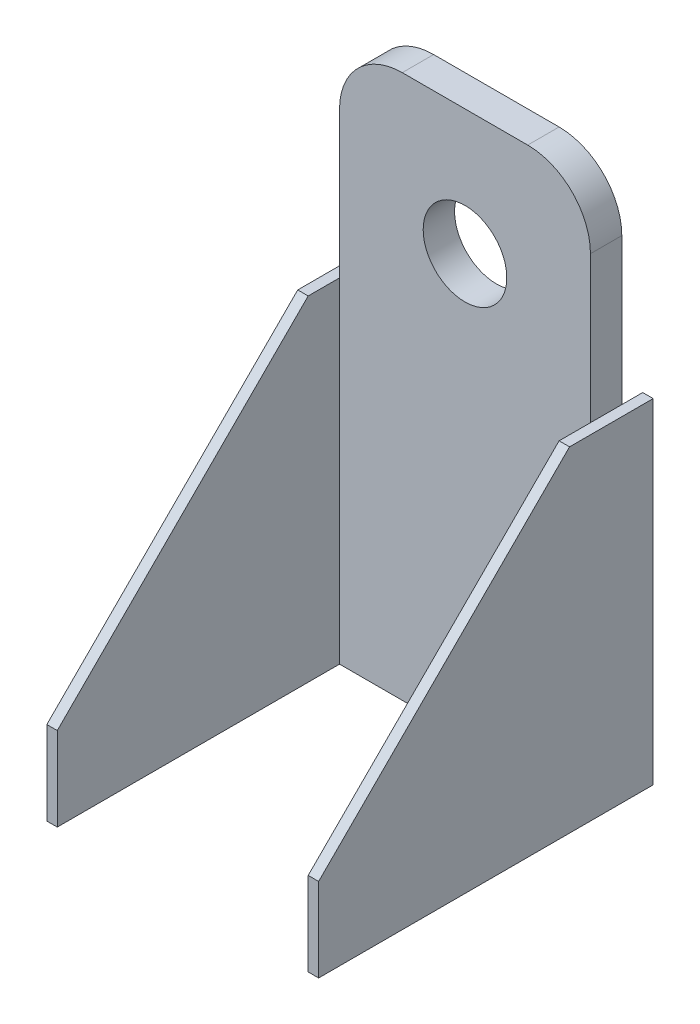
ISO-10303-21;
HEADER;
FILE_DESCRIPTION(('STEP AP214'),'2;1');
FILE_NAME('part.step','',(''),(''),'','','');
FILE_SCHEMA(('AUTOMOTIVE_DESIGN { 1 0 10303 214 1 1 1 1 }'));
ENDSEC;
DATA;
#1=APPLICATION_CONTEXT('core data for automotive mechanical design processes');
#2=APPLICATION_PROTOCOL_DEFINITION('international standard','automotive_design',2000,#1);
#3=PRODUCT_CONTEXT('',#1,'mechanical');
#4=PRODUCT('Part','Part','',(#3));
#5=PRODUCT_RELATED_PRODUCT_CATEGORY('part','',(#4));
#6=PRODUCT_DEFINITION_FORMATION('','',#4);
#7=PRODUCT_DEFINITION_CONTEXT('part definition',#1,'design');
#8=PRODUCT_DEFINITION('design','',#6,#7);
#9=PRODUCT_DEFINITION_SHAPE('','',#8);
#10=(LENGTH_UNIT() NAMED_UNIT(*) SI_UNIT(.MILLI.,.METRE.));
#11=(NAMED_UNIT(*) PLANE_ANGLE_UNIT() SI_UNIT($,.RADIAN.));
#12=(NAMED_UNIT(*) SI_UNIT($,.STERADIAN.) SOLID_ANGLE_UNIT());
#13=UNCERTAINTY_MEASURE_WITH_UNIT(LENGTH_MEASURE(1.E-05),#10,'distance_accuracy_value','');
#14=(GEOMETRIC_REPRESENTATION_CONTEXT(3) GLOBAL_UNCERTAINTY_ASSIGNED_CONTEXT((#13)) GLOBAL_UNIT_ASSIGNED_CONTEXT((#10,
#11,#12)) REPRESENTATION_CONTEXT('',''));
#15=CARTESIAN_POINT('',(0.,0.,0.));
#16=DIRECTION('',(0.,0.,1.));
#17=DIRECTION('',(1.,0.,0.));
#18=AXIS2_PLACEMENT_3D('',#15,#16,#17);
#19=CARTESIAN_POINT('',(76.2,76.2,19.05));
#20=DIRECTION('',(-1.,0.,0.));
#21=DIRECTION('',(0.,-1.,0.));
#22=AXIS2_PLACEMENT_3D('',#19,#20,#21);
#23=PLANE('',#22);
#24=DIRECTION('',(0.,0.,1.));
#25=VECTOR('',#24,1.);
#26=CARTESIAN_POINT('',(76.2,-50.8,19.05));
#27=LINE('',#26,#25);
#28=CARTESIAN_POINT('',(76.2,-50.8,0.));
#29=VERTEX_POINT('',#28);
#30=CARTESIAN_POINT('',(76.2,-50.8,19.05));
#31=VERTEX_POINT('',#30);
#32=EDGE_CURVE('E11',#29,#31,#27,.T.);
#33=ORIENTED_EDGE('',*,*,#32,.F.);
#34=DIRECTION('',(0.,1.,0.));
#35=VECTOR('',#34,1.);
#36=CARTESIAN_POINT('',(76.2,76.2,0.));
#37=LINE('',#36,#35);
#38=CARTESIAN_POINT('',(76.2,38.1,0.));
#39=VERTEX_POINT('',#38);
#40=EDGE_CURVE('E281',#29,#39,#37,.T.);
#41=ORIENTED_EDGE('',*,*,#40,.T.);
#42=DIRECTION('',(0.,0.,-1.));
#43=VECTOR('',#42,1.);
#44=CARTESIAN_POINT('',(76.2,38.1,19.05));
#45=LINE('',#44,#43);
#46=CARTESIAN_POINT('',(76.2,38.1,19.05));
#47=VERTEX_POINT('',#46);
#48=EDGE_CURVE('E296',#39,#47,#45,.F.);
#49=ORIENTED_EDGE('',*,*,#48,.T.);
#50=DIRECTION('',(0.,1.,0.));
#51=VECTOR('',#50,1.);
#52=CARTESIAN_POINT('',(76.2,76.2,19.05));
#53=LINE('',#52,#51);
#54=EDGE_CURVE('E50',#31,#47,#53,.T.);
#55=ORIENTED_EDGE('',*,*,#54,.F.);
#56=EDGE_LOOP('',(#33,#41,#49,#55));
#57=FACE_BOUND('',#56,.T.);
#58=ADVANCED_FACE('F35',(#57),#23,.F.);
#59=CARTESIAN_POINT('',(0.,0.,19.05));
#60=DIRECTION('',(0.,0.,1.));
#61=DIRECTION('',(1.,0.,0.));
#62=AXIS2_PLACEMENT_3D('',#59,#60,#61);
#63=PLANE('',#62);
#64=CARTESIAN_POINT('',(76.2,-254.,19.05));
#65=VERTEX_POINT('',#64);
#66=EDGE_CURVE('E270',#65,#31,#53,.T.);
#67=ORIENTED_EDGE('',*,*,#66,.T.);
#68=ORIENTED_EDGE('',*,*,#54,.T.);
#69=CARTESIAN_POINT('',(38.1,38.1,19.05));
#70=DIRECTION('',(0.,0.,1.));
#71=DIRECTION('',(1.,0.,0.));
#72=AXIS2_PLACEMENT_3D('',#69,#70,#71);
#73=CIRCLE('',#72,38.1);
#74=CARTESIAN_POINT('',(38.1,76.2,19.05));
#75=VERTEX_POINT('',#74);
#76=EDGE_CURVE('E300',#47,#75,#73,.T.);
#77=ORIENTED_EDGE('',*,*,#76,.T.);
#78=DIRECTION('',(-1.,0.,0.));
#79=VECTOR('',#78,1.);
#80=CARTESIAN_POINT('',(-76.2,76.2,19.05));
#81=LINE('',#80,#79);
#82=CARTESIAN_POINT('',(-38.1,76.2,19.05));
#83=VERTEX_POINT('',#82);
#84=EDGE_CURVE('E272',#75,#83,#81,.T.);
#85=ORIENTED_EDGE('',*,*,#84,.T.);
#86=CARTESIAN_POINT('',(-38.1,38.1,19.05));
#87=DIRECTION('',(0.,0.,1.));
#88=DIRECTION('',(1.,0.,0.));
#89=AXIS2_PLACEMENT_3D('',#86,#87,#88);
#90=CIRCLE('',#89,38.1);
#91=CARTESIAN_POINT('',(-76.2,38.1,19.05));
#92=VERTEX_POINT('',#91);
#93=EDGE_CURVE('E298',#83,#92,#90,.T.);
#94=ORIENTED_EDGE('',*,*,#93,.T.);
#95=DIRECTION('',(0.,-1.,0.));
#96=VECTOR('',#95,1.);
#97=CARTESIAN_POINT('',(-76.2,76.2,19.05));
#98=LINE('',#97,#96);
#99=CARTESIAN_POINT('',(-76.2,-50.8,19.05));
#100=VERTEX_POINT('',#99);
#101=EDGE_CURVE('E264',#92,#100,#98,.T.);
#102=ORIENTED_EDGE('',*,*,#101,.T.);
#103=DIRECTION('',(0.,1.,0.));
#104=VECTOR('',#103,1.);
#105=CARTESIAN_POINT('',(-76.2,0.,19.05));
#106=LINE('',#105,#104);
#107=CARTESIAN_POINT('',(-76.2,-254.,19.05));
#108=VERTEX_POINT('',#107);
#109=EDGE_CURVE('E215',#108,#100,#106,.T.);
#110=ORIENTED_EDGE('',*,*,#109,.F.);
#111=DIRECTION('',(1.,0.,0.));
#112=VECTOR('',#111,1.);
#113=CARTESIAN_POINT('',(-76.2,-254.,19.05));
#114=LINE('',#113,#112);
#115=EDGE_CURVE('E267',#108,#65,#114,.T.);
#116=ORIENTED_EDGE('',*,*,#115,.T.);
#117=EDGE_LOOP('',(#67,#68,#77,#85,#94,#102,#110,#116));
#118=FACE_BOUND('',#117,.T.);
#119=CARTESIAN_POINT('',(0.,0.,19.05));
#120=DIRECTION('',(0.,0.,1.));
#121=DIRECTION('',(1.,0.,0.));
#122=AXIS2_PLACEMENT_3D('',#119,#120,#121);
#123=CIRCLE('',#122,25.4);
#124=CARTESIAN_POINT('',(-25.4,0.,19.05));
#125=VERTEX_POINT('',#124);
#126=EDGE_CURVE('E258',#125,#125,#123,.T.);
#127=ORIENTED_EDGE('',*,*,#126,.F.);
#128=EDGE_LOOP('',(#127));
#129=FACE_BOUND('',#128,.T.);
#130=ADVANCED_FACE('F331',(#118,#129),#63,.T.);
#131=CARTESIAN_POINT('',(0.,0.,0.));
#132=DIRECTION('',(0.,0.,1.));
#133=DIRECTION('',(1.,0.,0.));
#134=AXIS2_PLACEMENT_3D('',#131,#132,#133);
#135=PLANE('',#134);
#136=DIRECTION('',(-1.,0.,0.));
#137=VECTOR('',#136,1.);
#138=CARTESIAN_POINT('',(-76.2,76.2,0.));
#139=LINE('',#138,#137);
#140=CARTESIAN_POINT('',(38.1,76.2,0.));
#141=VERTEX_POINT('',#140);
#142=CARTESIAN_POINT('',(-38.1,76.2,0.));
#143=VERTEX_POINT('',#142);
#144=EDGE_CURVE('E268',#141,#143,#139,.T.);
#145=ORIENTED_EDGE('',*,*,#144,.F.);
#146=CARTESIAN_POINT('',(38.1,38.1,0.));
#147=DIRECTION('',(0.,0.,1.));
#148=DIRECTION('',(1.,0.,0.));
#149=AXIS2_PLACEMENT_3D('',#146,#147,#148);
#150=CIRCLE('',#149,38.1);
#151=EDGE_CURVE('E293',#141,#39,#150,.F.);
#152=ORIENTED_EDGE('',*,*,#151,.T.);
#153=ORIENTED_EDGE('',*,*,#40,.F.);
#154=CARTESIAN_POINT('',(76.2,-254.,0.));
#155=VERTEX_POINT('',#154);
#156=EDGE_CURVE('E282',#155,#29,#37,.T.);
#157=ORIENTED_EDGE('',*,*,#156,.F.);
#158=DIRECTION('',(1.,0.,0.));
#159=VECTOR('',#158,1.);
#160=CARTESIAN_POINT('',(-76.2,-254.,0.));
#161=LINE('',#160,#159);
#162=CARTESIAN_POINT('',(-76.2,-254.,0.));
#163=VERTEX_POINT('',#162);
#164=EDGE_CURVE('E278',#163,#155,#161,.T.);
#165=ORIENTED_EDGE('',*,*,#164,.F.);
#166=DIRECTION('',(0.,1.,0.));
#167=VECTOR('',#166,1.);
#168=CARTESIAN_POINT('',(-76.2,0.,0.));
#169=LINE('',#168,#167);
#170=CARTESIAN_POINT('',(-76.2,-50.8,0.));
#171=VERTEX_POINT('',#170);
#172=EDGE_CURVE('E169',#163,#171,#169,.T.);
#173=ORIENTED_EDGE('',*,*,#172,.T.);
#174=DIRECTION('',(0.,-1.,0.));
#175=VECTOR('',#174,1.);
#176=CARTESIAN_POINT('',(-76.2,76.2,0.));
#177=LINE('',#176,#175);
#178=CARTESIAN_POINT('',(-76.2,38.1,0.));
#179=VERTEX_POINT('',#178);
#180=EDGE_CURVE('E261',#179,#171,#177,.T.);
#181=ORIENTED_EDGE('',*,*,#180,.F.);
#182=CARTESIAN_POINT('',(-38.1,38.1,0.));
#183=DIRECTION('',(0.,0.,1.));
#184=DIRECTION('',(1.,0.,0.));
#185=AXIS2_PLACEMENT_3D('',#182,#183,#184);
#186=CIRCLE('',#185,38.1);
#187=EDGE_CURVE('E291',#179,#143,#186,.F.);
#188=ORIENTED_EDGE('',*,*,#187,.T.);
#189=EDGE_LOOP('',(#145,#152,#153,#157,#165,#173,#181,#188));
#190=FACE_BOUND('',#189,.T.);
#191=CARTESIAN_POINT('',(0.,0.,0.));
#192=DIRECTION('',(0.,0.,1.));
#193=DIRECTION('',(1.,0.,0.));
#194=AXIS2_PLACEMENT_3D('',#191,#192,#193);
#195=CIRCLE('',#194,25.4);
#196=CARTESIAN_POINT('',(-25.4,0.,0.));
#197=VERTEX_POINT('',#196);
#198=EDGE_CURVE('E257',#197,#197,#195,.T.);
#199=ORIENTED_EDGE('',*,*,#198,.T.);
#200=EDGE_LOOP('',(#199));
#201=FACE_BOUND('',#200,.T.);
#202=ADVANCED_FACE('F312',(#190,#201),#135,.F.);
#203=CARTESIAN_POINT('',(-76.2,76.2,19.05));
#204=DIRECTION('',(1.,0.,0.));
#205=DIRECTION('',(0.,1.,0.));
#206=AXIS2_PLACEMENT_3D('',#203,#204,#205);
#207=PLANE('',#206);
#208=ORIENTED_EDGE('',*,*,#180,.T.);
#209=DIRECTION('',(0.,0.,1.));
#210=VECTOR('',#209,1.);
#211=CARTESIAN_POINT('',(-76.2,-50.8,38.1));
#212=LINE('',#211,#210);
#213=EDGE_CURVE('E196',#171,#100,#212,.T.);
#214=ORIENTED_EDGE('',*,*,#213,.T.);
#215=ORIENTED_EDGE('',*,*,#101,.F.);
#216=DIRECTION('',(0.,0.,-1.));
#217=VECTOR('',#216,1.);
#218=CARTESIAN_POINT('',(-76.2,38.1,19.05));
#219=LINE('',#218,#217);
#220=EDGE_CURVE('E43',#92,#179,#219,.T.);
#221=ORIENTED_EDGE('',*,*,#220,.T.);
#222=EDGE_LOOP('',(#208,#214,#215,#221));
#223=FACE_BOUND('',#222,.T.);
#224=ADVANCED_FACE('F306',(#223),#207,.F.);
#225=CARTESIAN_POINT('',(-76.2,-254.,19.05));
#226=DIRECTION('',(0.,1.,0.));
#227=DIRECTION('',(0.,0.,1.));
#228=AXIS2_PLACEMENT_3D('',#225,#226,#227);
#229=PLANE('',#228);
#230=ORIENTED_EDGE('',*,*,#164,.T.);
#231=DIRECTION('',(0.,0.,-1.));
#232=VECTOR('',#231,1.);
#233=CARTESIAN_POINT('',(76.2,-254.,-12.7));
#234=LINE('',#233,#232);
#235=CARTESIAN_POINT('',(76.2,-254.,-12.7));
#236=VERTEX_POINT('',#235);
#237=EDGE_CURVE('E238',#155,#236,#234,.T.);
#238=ORIENTED_EDGE('',*,*,#237,.T.);
#239=DIRECTION('',(-1.,0.,0.));
#240=VECTOR('',#239,1.);
#241=CARTESIAN_POINT('',(82.55,-254.,-12.7));
#242=LINE('',#241,#240);
#243=CARTESIAN_POINT('',(82.55,-254.,-12.7));
#244=VERTEX_POINT('',#243);
#245=EDGE_CURVE('E245',#244,#236,#242,.T.);
#246=ORIENTED_EDGE('',*,*,#245,.F.);
#247=DIRECTION('',(0.,0.,-1.));
#248=VECTOR('',#247,1.);
#249=CARTESIAN_POINT('',(82.55,-254.,-12.7));
#250=LINE('',#249,#248);
#251=CARTESIAN_POINT('',(82.55,-254.,190.5));
#252=VERTEX_POINT('',#251);
#253=EDGE_CURVE('E226',#252,#244,#250,.T.);
#254=ORIENTED_EDGE('',*,*,#253,.F.);
#255=DIRECTION('',(-1.,0.,0.));
#256=VECTOR('',#255,1.);
#257=CARTESIAN_POINT('',(82.55,-254.,190.5));
#258=LINE('',#257,#256);
#259=CARTESIAN_POINT('',(76.2,-254.,190.5));
#260=VERTEX_POINT('',#259);
#261=EDGE_CURVE('E248',#252,#260,#258,.T.);
#262=ORIENTED_EDGE('',*,*,#261,.T.);
#263=EDGE_CURVE('E239',#260,#65,#234,.T.);
#264=ORIENTED_EDGE('',*,*,#263,.T.);
#265=ORIENTED_EDGE('',*,*,#115,.F.);
#266=DIRECTION('',(0.,0.,-1.));
#267=VECTOR('',#266,1.);
#268=CARTESIAN_POINT('',(-76.2,-254.,-12.7));
#269=LINE('',#268,#267);
#270=CARTESIAN_POINT('',(-76.2,-254.,190.5));
#271=VERTEX_POINT('',#270);
#272=EDGE_CURVE('E200',#271,#108,#269,.T.);
#273=ORIENTED_EDGE('',*,*,#272,.F.);
#274=DIRECTION('',(1.,0.,0.));
#275=VECTOR('',#274,1.);
#276=CARTESIAN_POINT('',(-82.55,-254.,190.5));
#277=LINE('',#276,#275);
#278=CARTESIAN_POINT('',(-82.55,-254.,190.5));
#279=VERTEX_POINT('',#278);
#280=EDGE_CURVE('E210',#279,#271,#277,.T.);
#281=ORIENTED_EDGE('',*,*,#280,.F.);
#282=DIRECTION('',(0.,0.,-1.));
#283=VECTOR('',#282,1.);
#284=CARTESIAN_POINT('',(-82.55,-254.,-12.7));
#285=LINE('',#284,#283);
#286=CARTESIAN_POINT('',(-82.55,-254.,-12.7));
#287=VERTEX_POINT('',#286);
#288=EDGE_CURVE('E185',#279,#287,#285,.T.);
#289=ORIENTED_EDGE('',*,*,#288,.T.);
#290=DIRECTION('',(1.,0.,0.));
#291=VECTOR('',#290,1.);
#292=CARTESIAN_POINT('',(-82.55,-254.,-12.7));
#293=LINE('',#292,#291);
#294=CARTESIAN_POINT('',(-76.2,-254.,-12.7));
#295=VERTEX_POINT('',#294);
#296=EDGE_CURVE('E170',#287,#295,#293,.T.);
#297=ORIENTED_EDGE('',*,*,#296,.T.);
#298=EDGE_CURVE('E199',#163,#295,#269,.T.);
#299=ORIENTED_EDGE('',*,*,#298,.F.);
#300=EDGE_LOOP('',(#230,#238,#246,#254,#262,#264,#265,#273,#281,#289,#297,#299));
#301=FACE_BOUND('',#300,.T.);
#302=ADVANCED_FACE('F319',(#301),#229,.F.);
#303=CARTESIAN_POINT('',(-76.2,76.2,19.05));
#304=DIRECTION('',(0.,-1.,0.));
#305=DIRECTION('',(0.,0.,-1.));
#306=AXIS2_PLACEMENT_3D('',#303,#304,#305);
#307=PLANE('',#306);
#308=ORIENTED_EDGE('',*,*,#84,.F.);
#309=DIRECTION('',(0.,0.,-1.));
#310=VECTOR('',#309,1.);
#311=CARTESIAN_POINT('',(38.1,76.2,19.05));
#312=LINE('',#311,#310);
#313=EDGE_CURVE('E288',#75,#141,#312,.T.);
#314=ORIENTED_EDGE('',*,*,#313,.T.);
#315=ORIENTED_EDGE('',*,*,#144,.T.);
#316=DIRECTION('',(0.,0.,-1.));
#317=VECTOR('',#316,1.);
#318=CARTESIAN_POINT('',(-38.1,76.2,19.05));
#319=LINE('',#318,#317);
#320=EDGE_CURVE('E275',#143,#83,#319,.F.);
#321=ORIENTED_EDGE('',*,*,#320,.T.);
#322=EDGE_LOOP('',(#308,#314,#315,#321));
#323=FACE_BOUND('',#322,.T.);
#324=ADVANCED_FACE('F337',(#323),#307,.F.);
#325=CARTESIAN_POINT('',(0.,0.,19.05));
#326=DIRECTION('',(0.,0.,-1.));
#327=DIRECTION('',(-1.,0.,0.));
#328=AXIS2_PLACEMENT_3D('',#325,#326,#327);
#329=CYLINDRICAL_SURFACE('',#328,25.4);
#330=CARTESIAN_POINT('',(-25.4,0.,19.05));
#331=CARTESIAN_POINT('',(-25.4,0.,18.8515625));
#332=CARTESIAN_POINT('',(-25.4,0.,18.653125));
#333=CARTESIAN_POINT('',(-25.4,0.,18.25625));
#334=CARTESIAN_POINT('',(-25.4,0.,18.0578125));
#335=CARTESIAN_POINT('',(-25.4,0.,17.6609375));
#336=CARTESIAN_POINT('',(-25.4,0.,17.4625));
#337=CARTESIAN_POINT('',(-25.4,0.,17.065625));
#338=CARTESIAN_POINT('',(-25.4,0.,16.8671875));
#339=CARTESIAN_POINT('',(-25.4,0.,16.4703125));
#340=CARTESIAN_POINT('',(-25.4,0.,16.271875));
#341=CARTESIAN_POINT('',(-25.4,0.,15.875));
#342=CARTESIAN_POINT('',(-25.4,0.,15.6765625));
#343=CARTESIAN_POINT('',(-25.4,0.,15.2796875));
#344=CARTESIAN_POINT('',(-25.4,0.,15.08125));
#345=CARTESIAN_POINT('',(-25.4,0.,14.684375));
#346=CARTESIAN_POINT('',(-25.4,0.,14.4859375));
#347=CARTESIAN_POINT('',(-25.4,0.,14.0890625));
#348=CARTESIAN_POINT('',(-25.4,0.,13.890625));
#349=CARTESIAN_POINT('',(-25.4,0.,13.49375));
#350=CARTESIAN_POINT('',(-25.4,0.,13.2953125));
#351=CARTESIAN_POINT('',(-25.4,0.,12.8984375));
#352=CARTESIAN_POINT('',(-25.4,0.,12.7));
#353=CARTESIAN_POINT('',(-25.4,0.,12.303125));
#354=CARTESIAN_POINT('',(-25.4,0.,12.1046875));
#355=CARTESIAN_POINT('',(-25.4,0.,11.7078125));
#356=CARTESIAN_POINT('',(-25.4,0.,11.509375));
#357=CARTESIAN_POINT('',(-25.4,0.,11.1125));
#358=CARTESIAN_POINT('',(-25.4,0.,10.9140625));
#359=CARTESIAN_POINT('',(-25.4,0.,10.5171875));
#360=CARTESIAN_POINT('',(-25.4,0.,10.31875));
#361=CARTESIAN_POINT('',(-25.4,0.,9.921875));
#362=CARTESIAN_POINT('',(-25.4,0.,9.7234375));
#363=CARTESIAN_POINT('',(-25.4,0.,9.3265625));
#364=CARTESIAN_POINT('',(-25.4,0.,9.128125));
#365=CARTESIAN_POINT('',(-25.4,0.,8.73125));
#366=CARTESIAN_POINT('',(-25.4,0.,8.5328125));
#367=CARTESIAN_POINT('',(-25.4,0.,8.1359375));
#368=CARTESIAN_POINT('',(-25.4,0.,7.9375));
#369=CARTESIAN_POINT('',(-25.4,0.,7.540625));
#370=CARTESIAN_POINT('',(-25.4,0.,7.3421875));
#371=CARTESIAN_POINT('',(-25.4,0.,6.9453125));
#372=CARTESIAN_POINT('',(-25.4,0.,6.746875));
#373=CARTESIAN_POINT('',(-25.4,0.,6.35));
#374=CARTESIAN_POINT('',(-25.4,0.,6.1515625));
#375=CARTESIAN_POINT('',(-25.4,0.,5.7546875));
#376=CARTESIAN_POINT('',(-25.4,0.,5.55625));
#377=CARTESIAN_POINT('',(-25.4,0.,5.159375));
#378=CARTESIAN_POINT('',(-25.4,0.,4.9609375));
#379=CARTESIAN_POINT('',(-25.4,0.,4.5640625));
#380=CARTESIAN_POINT('',(-25.4,0.,4.365625));
#381=CARTESIAN_POINT('',(-25.4,0.,3.96875));
#382=CARTESIAN_POINT('',(-25.4,0.,3.7703125));
#383=CARTESIAN_POINT('',(-25.4,0.,3.3734375));
#384=CARTESIAN_POINT('',(-25.4,0.,3.175));
#385=CARTESIAN_POINT('',(-25.4,0.,2.778125));
#386=CARTESIAN_POINT('',(-25.4,0.,2.5796875));
#387=CARTESIAN_POINT('',(-25.4,0.,2.1828125));
#388=CARTESIAN_POINT('',(-25.4,0.,1.984375));
#389=CARTESIAN_POINT('',(-25.4,0.,1.5875));
#390=CARTESIAN_POINT('',(-25.4,0.,1.3890625));
#391=CARTESIAN_POINT('',(-25.4,0.,0.992187500000001));
#392=CARTESIAN_POINT('',(-25.4,0.,0.793750000000001));
#393=CARTESIAN_POINT('',(-25.4,0.,0.396875));
#394=CARTESIAN_POINT('',(-25.4,0.,0.1984375));
#395=CARTESIAN_POINT('',(-25.4,0.,0.));
#396=B_SPLINE_CURVE_WITH_KNOTS('',3,(#330,#331,#332,#333,#334,#335,#336,#337,#338,#339,#340,
#341,#342,#343,#344,#345,#346,#347,#348,#349,#350,#351,#352,#353,#354,#355,#356,#357,#358,#359,
#360,#361,#362,#363,#364,#365,#366,#367,#368,#369,#370,#371,#372,#373,#374,#375,#376,#377,#378,
#379,#380,#381,#382,#383,#384,#385,#386,#387,#388,#389,#390,#391,#392,#393,#394,#395),
.UNSPECIFIED.,.F.,.F.,(4,2,2,2,2,2,2,2,2,2,2,2,2,2,2,2,2,2,2,2,2,2,2,2,2,2,2,2,2,2,2,2,4),(0.,
0.5953125,1.190625,1.7859375,2.38125,2.9765625,3.571875,4.1671875,4.7625,5.3578125,5.953125,
6.5484375,7.14375,7.7390625,8.334375,8.9296875,9.525,10.1203125,10.715625,11.3109375,11.90625,
12.5015625,13.096875,13.6921875,14.2875,14.8828125,15.478125,16.0734375,16.66875,17.2640625,
17.859375,18.4546875,19.05),.UNSPECIFIED.);
#397=EDGE_CURVE('BSEAM356',#125,#197,#396,.T.);
#398=ORIENTED_EDGE('',*,*,#126,.T.);
#399=ORIENTED_EDGE('',*,*,#198,.F.);
#400=ORIENTED_EDGE('',*,*,#397,.T.);
#401=ORIENTED_EDGE('',*,*,#397,.F.);
#402=EDGE_LOOP('',(#398,#400,#399,#401));
#403=FACE_BOUND('',#402,.T.);
#404=ADVANCED_FACE('F356',(#403),#329,.F.);
#405=CARTESIAN_POINT('',(38.1,38.1,19.05));
#406=DIRECTION('',(0.,0.,-1.));
#407=DIRECTION('',(-1.,0.,0.));
#408=AXIS2_PLACEMENT_3D('',#405,#406,#407);
#409=CYLINDRICAL_SURFACE('',#408,38.1);
#410=ORIENTED_EDGE('',*,*,#76,.F.);
#411=ORIENTED_EDGE('',*,*,#48,.F.);
#412=ORIENTED_EDGE('',*,*,#151,.F.);
#413=ORIENTED_EDGE('',*,*,#313,.F.);
#414=EDGE_LOOP('',(#410,#411,#412,#413));
#415=FACE_BOUND('',#414,.T.);
#416=ADVANCED_FACE('F342',(#415),#409,.T.);
#417=CARTESIAN_POINT('',(-38.1,38.1,19.05));
#418=DIRECTION('',(0.,0.,-1.));
#419=DIRECTION('',(-1.,0.,0.));
#420=AXIS2_PLACEMENT_3D('',#417,#418,#419);
#421=CYLINDRICAL_SURFACE('',#420,38.1);
#422=ORIENTED_EDGE('',*,*,#93,.F.);
#423=ORIENTED_EDGE('',*,*,#320,.F.);
#424=ORIENTED_EDGE('',*,*,#187,.F.);
#425=ORIENTED_EDGE('',*,*,#220,.F.);
#426=EDGE_LOOP('',(#422,#423,#424,#425));
#427=FACE_BOUND('',#426,.T.);
#428=ADVANCED_FACE('F37',(#427),#421,.T.);
#429=CARTESIAN_POINT('',(76.2,0.,0.));
#430=DIRECTION('',(-1.,0.,0.));
#431=DIRECTION('',(0.,-1.,0.));
#432=AXIS2_PLACEMENT_3D('',#429,#430,#431);
#433=PLANE('',#432);
#434=ORIENTED_EDGE('',*,*,#156,.T.);
#435=DIRECTION('',(0.,0.,1.));
#436=VECTOR('',#435,1.);
#437=CARTESIAN_POINT('',(76.2,-50.8,38.1));
#438=LINE('',#437,#436);
#439=CARTESIAN_POINT('',(76.2,-50.8,-12.7));
#440=VERTEX_POINT('',#439);
#441=EDGE_CURVE('E231',#440,#29,#438,.T.);
#442=ORIENTED_EDGE('',*,*,#441,.F.);
#443=DIRECTION('',(0.,1.,0.));
#444=VECTOR('',#443,1.);
#445=CARTESIAN_POINT('',(76.2,-50.8,-12.7));
#446=LINE('',#445,#444);
#447=EDGE_CURVE('E222',#236,#440,#446,.T.);
#448=ORIENTED_EDGE('',*,*,#447,.F.);
#449=ORIENTED_EDGE('',*,*,#237,.F.);
#450=EDGE_LOOP('',(#434,#442,#448,#449));
#451=FACE_BOUND('',#450,.T.);
#452=ADVANCED_FACE('F361',(#451),#433,.T.);
#453=CARTESIAN_POINT('',(82.55,-50.8,38.1));
#454=DIRECTION('',(0.,-1.,0.));
#455=DIRECTION('',(1.,0.,0.));
#456=AXIS2_PLACEMENT_3D('',#453,#454,#455);
#457=PLANE('',#456);
#458=ORIENTED_EDGE('',*,*,#441,.T.);
#459=ORIENTED_EDGE('',*,*,#32,.T.);
#460=CARTESIAN_POINT('',(76.2,-50.8,38.1));
#461=VERTEX_POINT('',#460);
#462=EDGE_CURVE('E217',#31,#461,#438,.T.);
#463=ORIENTED_EDGE('',*,*,#462,.T.);
#464=DIRECTION('',(-1.,0.,0.));
#465=VECTOR('',#464,1.);
#466=CARTESIAN_POINT('',(82.55,-50.8,38.1));
#467=LINE('',#466,#465);
#468=CARTESIAN_POINT('',(82.55,-50.8,38.1));
#469=VERTEX_POINT('',#468);
#470=EDGE_CURVE('E254',#469,#461,#467,.T.);
#471=ORIENTED_EDGE('',*,*,#470,.F.);
#472=DIRECTION('',(0.,0.,1.));
#473=VECTOR('',#472,1.);
#474=CARTESIAN_POINT('',(82.55,-50.8,38.1));
#475=LINE('',#474,#473);
#476=CARTESIAN_POINT('',(82.55,-50.8,-12.7));
#477=VERTEX_POINT('',#476);
#478=EDGE_CURVE('E218',#477,#469,#475,.T.);
#479=ORIENTED_EDGE('',*,*,#478,.F.);
#480=DIRECTION('',(-1.,0.,0.));
#481=VECTOR('',#480,1.);
#482=CARTESIAN_POINT('',(82.55,-50.8,-12.7));
#483=LINE('',#482,#481);
#484=EDGE_CURVE('E230',#477,#440,#483,.T.);
#485=ORIENTED_EDGE('',*,*,#484,.T.);
#486=EDGE_LOOP('',(#458,#459,#463,#471,#479,#485));
#487=FACE_BOUND('',#486,.T.);
#488=ADVANCED_FACE('F369',(#487),#457,.F.);
#489=CARTESIAN_POINT('',(82.55,-203.2,190.5));
#490=DIRECTION('',(0.,-0.707106781186547,-0.707106781186548));
#491=DIRECTION('',(0.,0.707106781186548,-0.707106781186547));
#492=AXIS2_PLACEMENT_3D('',#489,#490,#491);
#493=PLANE('',#492);
#494=DIRECTION('',(0.,-0.707106781186548,0.707106781186548));
#495=VECTOR('',#494,1.);
#496=CARTESIAN_POINT('',(76.2,-203.2,190.5));
#497=LINE('',#496,#495);
#498=CARTESIAN_POINT('',(76.2,-203.2,190.5));
#499=VERTEX_POINT('',#498);
#500=EDGE_CURVE('E234',#461,#499,#497,.T.);
#501=ORIENTED_EDGE('',*,*,#500,.T.);
#502=DIRECTION('',(-1.,0.,0.));
#503=VECTOR('',#502,1.);
#504=CARTESIAN_POINT('',(82.55,-203.2,190.5));
#505=LINE('',#504,#503);
#506=CARTESIAN_POINT('',(82.55,-203.2,190.5));
#507=VERTEX_POINT('',#506);
#508=EDGE_CURVE('E251',#507,#499,#505,.T.);
#509=ORIENTED_EDGE('',*,*,#508,.F.);
#510=DIRECTION('',(0.,-0.707106781186548,0.707106781186548));
#511=VECTOR('',#510,1.);
#512=CARTESIAN_POINT('',(82.55,-203.2,190.5));
#513=LINE('',#512,#511);
#514=EDGE_CURVE('E221',#469,#507,#513,.T.);
#515=ORIENTED_EDGE('',*,*,#514,.F.);
#516=ORIENTED_EDGE('',*,*,#470,.T.);
#517=EDGE_LOOP('',(#501,#509,#515,#516));
#518=FACE_BOUND('',#517,.T.);
#519=ADVANCED_FACE('F426',(#518),#493,.F.);
#520=CARTESIAN_POINT('',(82.55,-254.,190.5));
#521=DIRECTION('',(0.,0.,-1.));
#522=DIRECTION('',(-1.,0.,0.));
#523=AXIS2_PLACEMENT_3D('',#520,#521,#522);
#524=PLANE('',#523);
#525=DIRECTION('',(0.,-1.,0.));
#526=VECTOR('',#525,1.);
#527=CARTESIAN_POINT('',(76.2,-254.,190.5));
#528=LINE('',#527,#526);
#529=EDGE_CURVE('E236',#499,#260,#528,.T.);
#530=ORIENTED_EDGE('',*,*,#529,.T.);
#531=ORIENTED_EDGE('',*,*,#261,.F.);
#532=DIRECTION('',(0.,-1.,0.));
#533=VECTOR('',#532,1.);
#534=CARTESIAN_POINT('',(82.55,-254.,190.5));
#535=LINE('',#534,#533);
#536=EDGE_CURVE('E224',#507,#252,#535,.T.);
#537=ORIENTED_EDGE('',*,*,#536,.F.);
#538=ORIENTED_EDGE('',*,*,#508,.T.);
#539=EDGE_LOOP('',(#530,#531,#537,#538));
#540=FACE_BOUND('',#539,.T.);
#541=ADVANCED_FACE('F435',(#540),#524,.F.);
#542=CARTESIAN_POINT('',(82.55,-50.8,-12.7));
#543=DIRECTION('',(0.,0.,1.));
#544=DIRECTION('',(0.,-1.,0.));
#545=AXIS2_PLACEMENT_3D('',#542,#543,#544);
#546=PLANE('',#545);
#547=ORIENTED_EDGE('',*,*,#447,.T.);
#548=ORIENTED_EDGE('',*,*,#484,.F.);
#549=DIRECTION('',(0.,1.,0.));
#550=VECTOR('',#549,1.);
#551=CARTESIAN_POINT('',(82.55,-50.8,-12.7));
#552=LINE('',#551,#550);
#553=EDGE_CURVE('E228',#244,#477,#552,.T.);
#554=ORIENTED_EDGE('',*,*,#553,.F.);
#555=ORIENTED_EDGE('',*,*,#245,.T.);
#556=EDGE_LOOP('',(#547,#548,#554,#555));
#557=FACE_BOUND('',#556,.T.);
#558=ADVANCED_FACE('F444',(#557),#546,.F.);
#559=CARTESIAN_POINT('',(82.55,0.,0.));
#560=DIRECTION('',(-1.,0.,0.));
#561=DIRECTION('',(0.,-1.,0.));
#562=AXIS2_PLACEMENT_3D('',#559,#560,#561);
#563=PLANE('',#562);
#564=ORIENTED_EDGE('',*,*,#478,.T.);
#565=ORIENTED_EDGE('',*,*,#514,.T.);
#566=ORIENTED_EDGE('',*,*,#536,.T.);
#567=ORIENTED_EDGE('',*,*,#253,.T.);
#568=ORIENTED_EDGE('',*,*,#553,.T.);
#569=EDGE_LOOP('',(#564,#565,#566,#567,#568));
#570=FACE_BOUND('',#569,.T.);
#571=ADVANCED_FACE('F454',(#570),#563,.F.);
#572=ORIENTED_EDGE('',*,*,#462,.F.);
#573=ORIENTED_EDGE('',*,*,#66,.F.);
#574=ORIENTED_EDGE('',*,*,#263,.F.);
#575=ORIENTED_EDGE('',*,*,#529,.F.);
#576=ORIENTED_EDGE('',*,*,#500,.F.);
#577=EDGE_LOOP('',(#572,#573,#574,#575,#576));
#578=FACE_BOUND('',#577,.T.);
#579=ADVANCED_FACE('F418',(#578),#433,.T.);
#580=CARTESIAN_POINT('',(-76.2,0.,0.));
#581=DIRECTION('',(1.,0.,0.));
#582=DIRECTION('',(0.,-1.,0.));
#583=AXIS2_PLACEMENT_3D('',#580,#581,#582);
#584=PLANE('',#583);
#585=ORIENTED_EDGE('',*,*,#172,.F.);
#586=ORIENTED_EDGE('',*,*,#298,.T.);
#587=DIRECTION('',(0.,1.,0.));
#588=VECTOR('',#587,1.);
#589=CARTESIAN_POINT('',(-76.2,-50.8,-12.7));
#590=LINE('',#589,#588);
#591=CARTESIAN_POINT('',(-76.2,-50.8,-12.7));
#592=VERTEX_POINT('',#591);
#593=EDGE_CURVE('E195',#295,#592,#590,.T.);
#594=ORIENTED_EDGE('',*,*,#593,.T.);
#595=EDGE_CURVE('E164',#592,#171,#212,.T.);
#596=ORIENTED_EDGE('',*,*,#595,.T.);
#597=EDGE_LOOP('',(#585,#586,#594,#596));
#598=FACE_BOUND('',#597,.T.);
#599=ADVANCED_FACE('F317',(#598),#584,.T.);
#600=CARTESIAN_POINT('',(-82.55,-50.8,38.1));
#601=DIRECTION('',(0.,1.,0.));
#602=DIRECTION('',(-1.,0.,0.));
#603=AXIS2_PLACEMENT_3D('',#600,#601,#602);
#604=PLANE('',#603);
#605=ORIENTED_EDGE('',*,*,#595,.F.);
#606=DIRECTION('',(1.,0.,0.));
#607=VECTOR('',#606,1.);
#608=CARTESIAN_POINT('',(-82.55,-50.8,-12.7));
#609=LINE('',#608,#607);
#610=CARTESIAN_POINT('',(-82.55,-50.8,-12.7));
#611=VERTEX_POINT('',#610);
#612=EDGE_CURVE('E157',#611,#592,#609,.T.);
#613=ORIENTED_EDGE('',*,*,#612,.F.);
#614=DIRECTION('',(0.,0.,1.));
#615=VECTOR('',#614,1.);
#616=CARTESIAN_POINT('',(-82.55,-50.8,38.1));
#617=LINE('',#616,#615);
#618=CARTESIAN_POINT('',(-82.55,-50.8,38.1));
#619=VERTEX_POINT('',#618);
#620=EDGE_CURVE('E161',#611,#619,#617,.T.);
#621=ORIENTED_EDGE('',*,*,#620,.T.);
#622=DIRECTION('',(1.,0.,0.));
#623=VECTOR('',#622,1.);
#624=CARTESIAN_POINT('',(-82.55,-50.8,38.1));
#625=LINE('',#624,#623);
#626=CARTESIAN_POINT('',(-76.2,-50.8,38.1));
#627=VERTEX_POINT('',#626);
#628=EDGE_CURVE('E193',#619,#627,#625,.T.);
#629=ORIENTED_EDGE('',*,*,#628,.T.);
#630=EDGE_CURVE('E197',#100,#627,#212,.T.);
#631=ORIENTED_EDGE('',*,*,#630,.F.);
#632=ORIENTED_EDGE('',*,*,#213,.F.);
#633=EDGE_LOOP('',(#605,#613,#621,#629,#631,#632));
#634=FACE_BOUND('',#633,.T.);
#635=ADVANCED_FACE('F159',(#634),#604,.T.);
#636=CARTESIAN_POINT('',(-82.55,-50.8,-12.7));
#637=DIRECTION('',(0.,0.,-1.));
#638=DIRECTION('',(0.,1.,0.));
#639=AXIS2_PLACEMENT_3D('',#636,#637,#638);
#640=PLANE('',#639);
#641=ORIENTED_EDGE('',*,*,#593,.F.);
#642=ORIENTED_EDGE('',*,*,#296,.F.);
#643=DIRECTION('',(0.,1.,0.));
#644=VECTOR('',#643,1.);
#645=CARTESIAN_POINT('',(-82.55,-50.8,-12.7));
#646=LINE('',#645,#644);
#647=EDGE_CURVE('E176',#287,#611,#646,.T.);
#648=ORIENTED_EDGE('',*,*,#647,.T.);
#649=ORIENTED_EDGE('',*,*,#612,.T.);
#650=EDGE_LOOP('',(#641,#642,#648,#649));
#651=FACE_BOUND('',#650,.T.);
#652=ADVANCED_FACE('F183',(#651),#640,.T.);
#653=CARTESIAN_POINT('',(-82.55,-254.,190.5));
#654=DIRECTION('',(0.,0.,1.));
#655=DIRECTION('',(1.,0.,0.));
#656=AXIS2_PLACEMENT_3D('',#653,#654,#655);
#657=PLANE('',#656);
#658=DIRECTION('',(0.,-1.,0.));
#659=VECTOR('',#658,1.);
#660=CARTESIAN_POINT('',(-76.2,-254.,190.5));
#661=LINE('',#660,#659);
#662=CARTESIAN_POINT('',(-76.2,-203.2,190.5));
#663=VERTEX_POINT('',#662);
#664=EDGE_CURVE('E202',#663,#271,#661,.T.);
#665=ORIENTED_EDGE('',*,*,#664,.F.);
#666=DIRECTION('',(1.,0.,0.));
#667=VECTOR('',#666,1.);
#668=CARTESIAN_POINT('',(-82.55,-203.2,190.5));
#669=LINE('',#668,#667);
#670=CARTESIAN_POINT('',(-82.55,-203.2,190.5));
#671=VERTEX_POINT('',#670);
#672=EDGE_CURVE('E208',#671,#663,#669,.T.);
#673=ORIENTED_EDGE('',*,*,#672,.F.);
#674=DIRECTION('',(0.,-1.,0.));
#675=VECTOR('',#674,1.);
#676=CARTESIAN_POINT('',(-82.55,-254.,190.5));
#677=LINE('',#676,#675);
#678=EDGE_CURVE('E187',#671,#279,#677,.T.);
#679=ORIENTED_EDGE('',*,*,#678,.T.);
#680=ORIENTED_EDGE('',*,*,#280,.T.);
#681=EDGE_LOOP('',(#665,#673,#679,#680));
#682=FACE_BOUND('',#681,.T.);
#683=ADVANCED_FACE('F323',(#682),#657,.T.);
#684=CARTESIAN_POINT('',(-82.55,-203.2,190.5));
#685=DIRECTION('',(0.,0.707106781186547,0.707106781186548));
#686=DIRECTION('',(0.,-0.707106781186548,0.707106781186547));
#687=AXIS2_PLACEMENT_3D('',#684,#685,#686);
#688=PLANE('',#687);
#689=DIRECTION('',(0.,-0.707106781186548,0.707106781186548));
#690=VECTOR('',#689,1.);
#691=CARTESIAN_POINT('',(-76.2,-203.2,190.5));
#692=LINE('',#691,#690);
#693=EDGE_CURVE('E181',#627,#663,#692,.T.);
#694=ORIENTED_EDGE('',*,*,#693,.F.);
#695=ORIENTED_EDGE('',*,*,#628,.F.);
#696=DIRECTION('',(0.,-0.707106781186548,0.707106781186548));
#697=VECTOR('',#696,1.);
#698=CARTESIAN_POINT('',(-82.55,-203.2,190.5));
#699=LINE('',#698,#697);
#700=EDGE_CURVE('E180',#619,#671,#699,.T.);
#701=ORIENTED_EDGE('',*,*,#700,.T.);
#702=ORIENTED_EDGE('',*,*,#672,.T.);
#703=EDGE_LOOP('',(#694,#695,#701,#702));
#704=FACE_BOUND('',#703,.T.);
#705=ADVANCED_FACE('F326',(#704),#688,.T.);
#706=CARTESIAN_POINT('',(-82.55,0.,0.));
#707=DIRECTION('',(1.,0.,0.));
#708=DIRECTION('',(0.,-1.,0.));
#709=AXIS2_PLACEMENT_3D('',#706,#707,#708);
#710=PLANE('',#709);
#711=ORIENTED_EDGE('',*,*,#620,.F.);
#712=ORIENTED_EDGE('',*,*,#647,.F.);
#713=ORIENTED_EDGE('',*,*,#288,.F.);
#714=ORIENTED_EDGE('',*,*,#678,.F.);
#715=ORIENTED_EDGE('',*,*,#700,.F.);
#716=EDGE_LOOP('',(#711,#712,#713,#714,#715));
#717=FACE_BOUND('',#716,.T.);
#718=ADVANCED_FACE('F174',(#717),#710,.F.);
#719=ORIENTED_EDGE('',*,*,#272,.T.);
#720=ORIENTED_EDGE('',*,*,#109,.T.);
#721=ORIENTED_EDGE('',*,*,#630,.T.);
#722=ORIENTED_EDGE('',*,*,#693,.T.);
#723=ORIENTED_EDGE('',*,*,#664,.T.);
#724=EDGE_LOOP('',(#719,#720,#721,#722,#723));
#725=FACE_BOUND('',#724,.T.);
#726=ADVANCED_FACE('F488',(#725),#584,.T.);
#727=CLOSED_SHELL('',(#58,#130,#202,#224,#302,#324,#404,#416,#428,#452,#488,#519,#541,#558,#571,
#579,#599,#635,#652,#683,#705,#718,#726));
#728=MANIFOLD_SOLID_BREP('B2',#727);
#729=ADVANCED_BREP_SHAPE_REPRESENTATION('',(#18,#728),#14);
#730=SHAPE_DEFINITION_REPRESENTATION(#9,#729);
ENDSEC;
END-ISO-10303-21;
